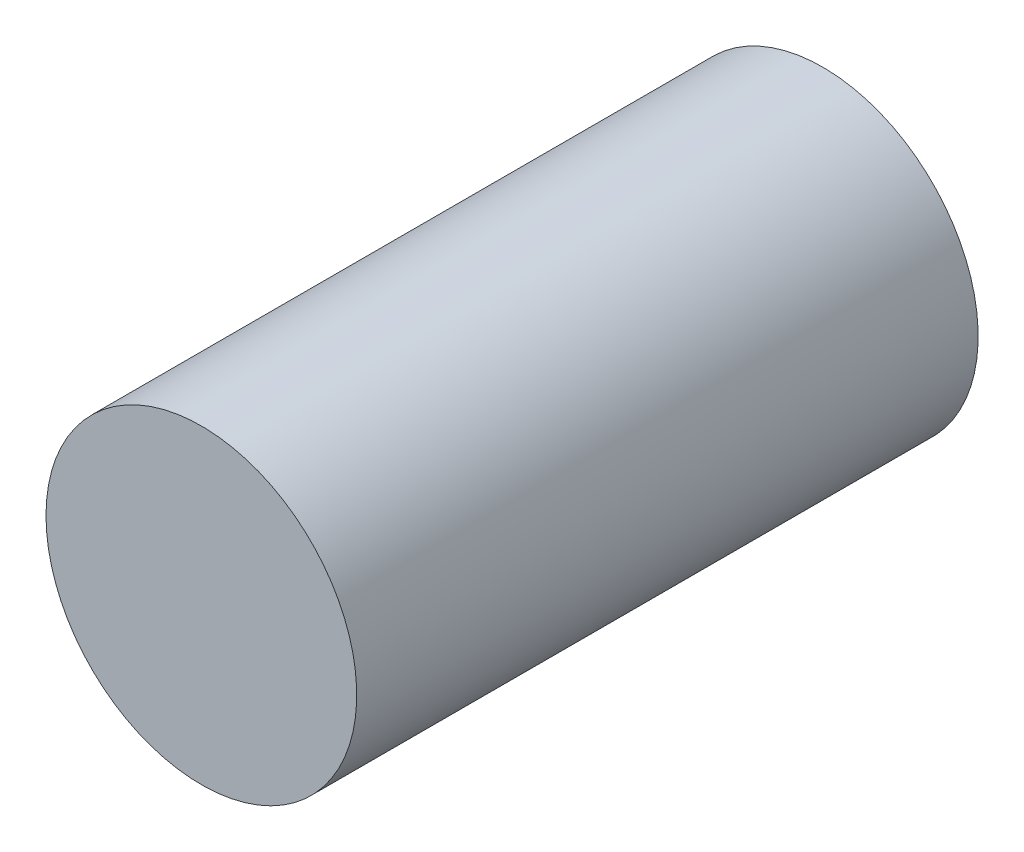
ISO-10303-21;
HEADER;
FILE_DESCRIPTION(('STEP AP214'),'2;1');
FILE_NAME('part.step','',(''),(''),'','','');
FILE_SCHEMA(('AUTOMOTIVE_DESIGN { 1 0 10303 214 1 1 1 1 }'));
ENDSEC;
DATA;
#1=APPLICATION_CONTEXT('core data for automotive mechanical design processes');
#2=APPLICATION_PROTOCOL_DEFINITION('international standard','automotive_design',2000,#1);
#3=PRODUCT_CONTEXT('',#1,'mechanical');
#4=PRODUCT('Part','Part','',(#3));
#5=PRODUCT_RELATED_PRODUCT_CATEGORY('part','',(#4));
#6=PRODUCT_DEFINITION_FORMATION('','',#4);
#7=PRODUCT_DEFINITION_CONTEXT('part definition',#1,'design');
#8=PRODUCT_DEFINITION('design','',#6,#7);
#9=PRODUCT_DEFINITION_SHAPE('','',#8);
#10=(LENGTH_UNIT() NAMED_UNIT(*) SI_UNIT(.MILLI.,.METRE.));
#11=(NAMED_UNIT(*) PLANE_ANGLE_UNIT() SI_UNIT($,.RADIAN.));
#12=(NAMED_UNIT(*) SI_UNIT($,.STERADIAN.) SOLID_ANGLE_UNIT());
#13=UNCERTAINTY_MEASURE_WITH_UNIT(LENGTH_MEASURE(1.E-05),#10,'distance_accuracy_value','');
#14=(GEOMETRIC_REPRESENTATION_CONTEXT(3) GLOBAL_UNCERTAINTY_ASSIGNED_CONTEXT((#13)) GLOBAL_UNIT_ASSIGNED_CONTEXT((#10,
#11,#12)) REPRESENTATION_CONTEXT('',''));
#15=CARTESIAN_POINT('',(0.,0.,0.));
#16=DIRECTION('',(0.,0.,1.));
#17=DIRECTION('',(1.,0.,0.));
#18=AXIS2_PLACEMENT_3D('',#15,#16,#17);
#19=CARTESIAN_POINT('',(0.,0.,609.6));
#20=DIRECTION('',(0.,0.,-1.));
#21=DIRECTION('',(-1.,0.,0.));
#22=AXIS2_PLACEMENT_3D('',#19,#20,#21);
#23=CYLINDRICAL_SURFACE('',#22,152.4);
#24=CARTESIAN_POINT('',(0.,0.,609.6));
#25=DIRECTION('',(0.,0.,1.));
#26=DIRECTION('',(1.,0.,0.));
#27=AXIS2_PLACEMENT_3D('',#24,#25,#26);
#28=CIRCLE('',#27,152.4);
#29=CARTESIAN_POINT('',(-152.4,0.,609.6));
#30=VERTEX_POINT('',#29);
#31=EDGE_CURVE('E10',#30,#30,#28,.T.);
#32=CARTESIAN_POINT('',(0.,0.,0.));
#33=DIRECTION('',(0.,0.,1.));
#34=DIRECTION('',(1.,0.,0.));
#35=AXIS2_PLACEMENT_3D('',#32,#33,#34);
#36=CIRCLE('',#35,152.4);
#37=CARTESIAN_POINT('',(-152.4,0.,0.));
#38=VERTEX_POINT('',#37);
#39=EDGE_CURVE('E40',#38,#38,#36,.T.);
#40=CARTESIAN_POINT('',(-152.4,0.,609.6));
#41=CARTESIAN_POINT('',(-152.4,0.,603.25));
#42=CARTESIAN_POINT('',(-152.4,0.,596.9));
#43=CARTESIAN_POINT('',(-152.4,0.,584.2));
#44=CARTESIAN_POINT('',(-152.4,0.,577.85));
#45=CARTESIAN_POINT('',(-152.4,0.,565.15));
#46=CARTESIAN_POINT('',(-152.4,0.,558.8));
#47=CARTESIAN_POINT('',(-152.4,0.,546.1));
#48=CARTESIAN_POINT('',(-152.4,0.,539.75));
#49=CARTESIAN_POINT('',(-152.4,0.,527.05));
#50=CARTESIAN_POINT('',(-152.4,0.,520.7));
#51=CARTESIAN_POINT('',(-152.4,0.,508.));
#52=CARTESIAN_POINT('',(-152.4,0.,501.65));
#53=CARTESIAN_POINT('',(-152.4,0.,488.95));
#54=CARTESIAN_POINT('',(-152.4,0.,482.6));
#55=CARTESIAN_POINT('',(-152.4,0.,469.9));
#56=CARTESIAN_POINT('',(-152.4,0.,463.55));
#57=CARTESIAN_POINT('',(-152.4,0.,450.85));
#58=CARTESIAN_POINT('',(-152.4,0.,444.5));
#59=CARTESIAN_POINT('',(-152.4,0.,431.8));
#60=CARTESIAN_POINT('',(-152.4,0.,425.45));
#61=CARTESIAN_POINT('',(-152.4,0.,412.75));
#62=CARTESIAN_POINT('',(-152.4,0.,406.4));
#63=CARTESIAN_POINT('',(-152.4,0.,393.7));
#64=CARTESIAN_POINT('',(-152.4,0.,387.35));
#65=CARTESIAN_POINT('',(-152.4,0.,374.65));
#66=CARTESIAN_POINT('',(-152.4,0.,368.3));
#67=CARTESIAN_POINT('',(-152.4,0.,355.6));
#68=CARTESIAN_POINT('',(-152.4,0.,349.25));
#69=CARTESIAN_POINT('',(-152.4,0.,336.55));
#70=CARTESIAN_POINT('',(-152.4,0.,330.2));
#71=CARTESIAN_POINT('',(-152.4,0.,317.5));
#72=CARTESIAN_POINT('',(-152.4,0.,311.15));
#73=CARTESIAN_POINT('',(-152.4,0.,298.45));
#74=CARTESIAN_POINT('',(-152.4,0.,292.1));
#75=CARTESIAN_POINT('',(-152.4,0.,279.4));
#76=CARTESIAN_POINT('',(-152.4,0.,273.05));
#77=CARTESIAN_POINT('',(-152.4,0.,260.35));
#78=CARTESIAN_POINT('',(-152.4,0.,254.));
#79=CARTESIAN_POINT('',(-152.4,0.,241.3));
#80=CARTESIAN_POINT('',(-152.4,0.,234.95));
#81=CARTESIAN_POINT('',(-152.4,0.,222.25));
#82=CARTESIAN_POINT('',(-152.4,0.,215.9));
#83=CARTESIAN_POINT('',(-152.4,0.,203.2));
#84=CARTESIAN_POINT('',(-152.4,0.,196.85));
#85=CARTESIAN_POINT('',(-152.4,0.,184.15));
#86=CARTESIAN_POINT('',(-152.4,0.,177.8));
#87=CARTESIAN_POINT('',(-152.4,0.,165.1));
#88=CARTESIAN_POINT('',(-152.4,0.,158.75));
#89=CARTESIAN_POINT('',(-152.4,0.,146.05));
#90=CARTESIAN_POINT('',(-152.4,0.,139.7));
#91=CARTESIAN_POINT('',(-152.4,0.,127.));
#92=CARTESIAN_POINT('',(-152.4,0.,120.65));
#93=CARTESIAN_POINT('',(-152.4,0.,107.95));
#94=CARTESIAN_POINT('',(-152.4,0.,101.6));
#95=CARTESIAN_POINT('',(-152.4,0.,88.9));
#96=CARTESIAN_POINT('',(-152.4,0.,82.5500000000001));
#97=CARTESIAN_POINT('',(-152.4,0.,69.85));
#98=CARTESIAN_POINT('',(-152.4,0.,63.5));
#99=CARTESIAN_POINT('',(-152.4,0.,50.8));
#100=CARTESIAN_POINT('',(-152.4,0.,44.45));
#101=CARTESIAN_POINT('',(-152.4,0.,31.75));
#102=CARTESIAN_POINT('',(-152.4,0.,25.4));
#103=CARTESIAN_POINT('',(-152.4,0.,12.7));
#104=CARTESIAN_POINT('',(-152.4,0.,6.35000000000001));
#105=CARTESIAN_POINT('',(-152.4,0.,0.));
#106=B_SPLINE_CURVE_WITH_KNOTS('',3,(#40,#41,#42,#43,#44,#45,#46,#47,#48,#49,#50,#51,#52,#53,
#54,#55,#56,#57,#58,#59,#60,#61,#62,#63,#64,#65,#66,#67,#68,#69,#70,#71,#72,#73,#74,#75,#76,#77,
#78,#79,#80,#81,#82,#83,#84,#85,#86,#87,#88,#89,#90,#91,#92,#93,#94,#95,#96,#97,#98,#99,#100,
#101,#102,#103,#104,#105),.UNSPECIFIED.,.F.,.F.,(4,2,2,2,2,2,2,2,2,2,2,2,2,2,2,2,2,2,2,2,2,2,2,
2,2,2,2,2,2,2,2,2,4),(0.,19.05,38.1,57.15,76.2,95.2500000000001,114.3,133.35,152.4,171.45,190.5,
209.55,228.6,247.65,266.7,285.75,304.8,323.85,342.9,361.95,381.,400.05,419.1,438.15,457.2,
476.25,495.3,514.35,533.4,552.45,571.5,590.55,609.6),.UNSPECIFIED.);
#107=EDGE_CURVE('BSEAM37',#30,#38,#106,.T.);
#108=ORIENTED_EDGE('',*,*,#31,.F.);
#109=ORIENTED_EDGE('',*,*,#39,.T.);
#110=ORIENTED_EDGE('',*,*,#107,.T.);
#111=ORIENTED_EDGE('',*,*,#107,.F.);
#112=EDGE_LOOP('',(#108,#110,#109,#111));
#113=FACE_BOUND('',#112,.T.);
#114=ADVANCED_FACE('F37',(#113),#23,.T.);
#115=CARTESIAN_POINT('',(0.,0.,609.6));
#116=DIRECTION('',(0.,0.,1.));
#117=DIRECTION('',(1.,0.,0.));
#118=AXIS2_PLACEMENT_3D('',#115,#116,#117);
#119=PLANE('',#118);
#120=ORIENTED_EDGE('',*,*,#31,.T.);
#121=EDGE_LOOP('',(#120));
#122=FACE_BOUND('',#121,.T.);
#123=ADVANCED_FACE('F54',(#122),#119,.T.);
#124=CARTESIAN_POINT('',(0.,0.,0.));
#125=DIRECTION('',(0.,0.,1.));
#126=DIRECTION('',(1.,0.,0.));
#127=AXIS2_PLACEMENT_3D('',#124,#125,#126);
#128=PLANE('',#127);
#129=ORIENTED_EDGE('',*,*,#39,.F.);
#130=EDGE_LOOP('',(#129));
#131=FACE_BOUND('',#130,.T.);
#132=ADVANCED_FACE('F52',(#131),#128,.F.);
#133=CLOSED_SHELL('',(#114,#123,#132));
#134=MANIFOLD_SOLID_BREP('B2',#133);
#135=ADVANCED_BREP_SHAPE_REPRESENTATION('',(#18,#134),#14);
#136=SHAPE_DEFINITION_REPRESENTATION(#9,#135);
ENDSEC;
END-ISO-10303-21;
